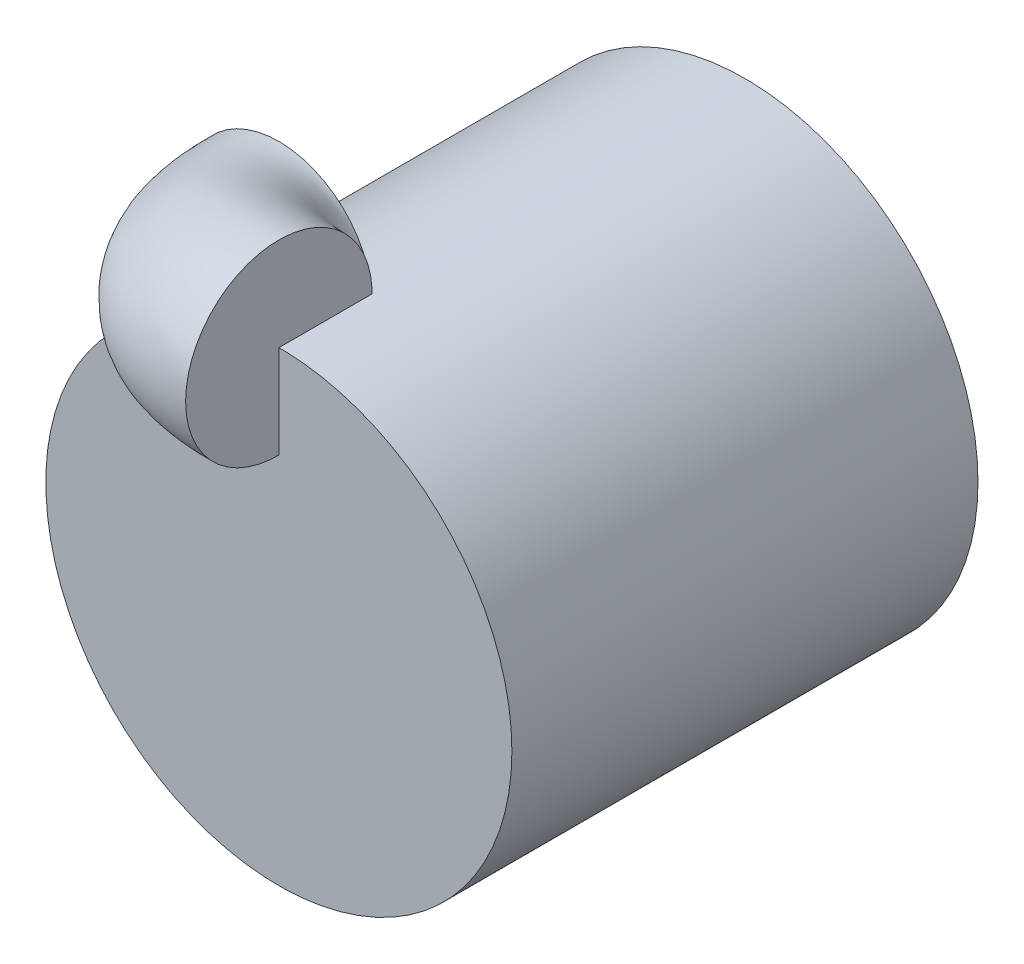
ISO-10303-21;
HEADER;
FILE_DESCRIPTION(('STEP AP214'),'2;1');
FILE_NAME('part.step','',(''),(''),'','','');
FILE_SCHEMA(('AUTOMOTIVE_DESIGN { 1 0 10303 214 1 1 1 1 }'));
ENDSEC;
DATA;
#1=APPLICATION_CONTEXT('core data for automotive mechanical design processes');
#2=APPLICATION_PROTOCOL_DEFINITION('international standard','automotive_design',2000,#1);
#3=PRODUCT_CONTEXT('',#1,'mechanical');
#4=PRODUCT('Part','Part','',(#3));
#5=PRODUCT_RELATED_PRODUCT_CATEGORY('part','',(#4));
#6=PRODUCT_DEFINITION_FORMATION('','',#4);
#7=PRODUCT_DEFINITION_CONTEXT('part definition',#1,'design');
#8=PRODUCT_DEFINITION('design','',#6,#7);
#9=PRODUCT_DEFINITION_SHAPE('','',#8);
#10=(LENGTH_UNIT() NAMED_UNIT(*) SI_UNIT(.MILLI.,.METRE.));
#11=(NAMED_UNIT(*) PLANE_ANGLE_UNIT() SI_UNIT($,.RADIAN.));
#12=(NAMED_UNIT(*) SI_UNIT($,.STERADIAN.) SOLID_ANGLE_UNIT());
#13=UNCERTAINTY_MEASURE_WITH_UNIT(LENGTH_MEASURE(1.E-05),#10,'distance_accuracy_value','');
#14=(GEOMETRIC_REPRESENTATION_CONTEXT(3) GLOBAL_UNCERTAINTY_ASSIGNED_CONTEXT((#13)) GLOBAL_UNIT_ASSIGNED_CONTEXT((#10,
#11,#12)) REPRESENTATION_CONTEXT('',''));
#15=CARTESIAN_POINT('',(0.,0.,0.));
#16=DIRECTION('',(0.,0.,1.));
#17=DIRECTION('',(1.,0.,0.));
#18=AXIS2_PLACEMENT_3D('',#15,#16,#17);
#19=CARTESIAN_POINT('',(-1.25,2.1650635094611,-1.25));
#20=DIRECTION('',(0.,0.,1.));
#21=DIRECTION('',(-0.966372106164342,-0.257147724912146,0.));
#22=AXIS2_PLACEMENT_3D('',#19,#20,#21);
#23=PLANE('',#22);
#24=CARTESIAN_POINT('',(-1.25,2.1650635094611,-1.25));
#25=DIRECTION('',(0.,0.,-1.));
#26=DIRECTION('',(-0.966372106164342,-0.257147724912146,0.));
#27=AXIS2_PLACEMENT_3D('',#24,#25,#26);
#28=CIRCLE('',#27,1.);
#29=CARTESIAN_POINT('',(-2.21637210616434,1.90791578454895,-1.24999999999999));
#30=VERTEX_POINT('',#29);
#31=EDGE_CURVE('E49',#30,#30,#28,.T.);
#32=ORIENTED_EDGE('',*,*,#31,.T.);
#33=EDGE_LOOP('',(#32));
#34=FACE_BOUND('',#33,.T.);
#35=ADVANCED_FACE('F42',(#34),#23,.F.);
#36=CARTESIAN_POINT('',(0.,2.5,0.));
#37=DIRECTION('',(1.,0.,0.));
#38=DIRECTION('',(0.,0.,1.));
#39=AXIS2_PLACEMENT_3D('',#36,#37,#38);
#40=PLANE('',#39);
#41=CARTESIAN_POINT('',(0.,2.5,0.));
#42=DIRECTION('',(-1.,0.,0.));
#43=DIRECTION('',(0.,0.,1.));
#44=AXIS2_PLACEMENT_3D('',#41,#42,#43);
#45=CIRCLE('',#44,1.);
#46=CARTESIAN_POINT('',(0.,2.5,1.));
#47=VERTEX_POINT('',#46);
#48=EDGE_CURVE('E12',#47,#47,#45,.T.);
#49=ORIENTED_EDGE('',*,*,#48,.F.);
#50=EDGE_LOOP('',(#49));
#51=FACE_BOUND('',#50,.T.);
#52=ADVANCED_FACE('F59',(#51),#40,.T.);
#53=CARTESIAN_POINT('',(-2.21637210616434,1.90791578454895,-1.24999999999999));
#54=CARTESIAN_POINT('',(-2.21637204277202,1.9079158294468,-0.999818841970199));
#55=CARTESIAN_POINT('',(-2.17734659589949,1.93081632266178,-0.759523379998778));
#56=CARTESIAN_POINT('',(-2.03135644994759,2.00980930953423,-0.306379773603847));
#57=CARTESIAN_POINT('',(-1.92860055065562,2.06253745159382,-0.104736018125595));
#58=CARTESIAN_POINT('',(-1.66161034219067,2.18187079444576,0.272350489804926));
#59=CARTESIAN_POINT('',(-1.49602176305505,2.24678737741098,0.439674774448092));
#60=CARTESIAN_POINT('',(-1.09699531476877,2.36944390041126,0.729493839687819));
#61=CARTESIAN_POINT('',(-0.865637475439157,2.42345413399622,0.843507948703797));
#62=CARTESIAN_POINT('',(-0.411959624278028,2.48556252003317,0.971375649153301));
#63=CARTESIAN_POINT('',(-0.208302096235686,2.4999999772387,0.999999961640218));
#64=CARTESIAN_POINT('',(0.,2.5,1.));
#65=CARTESIAN_POINT('',(-2.73066755598863,3.84065999687763,-1.25));
#66=CARTESIAN_POINT('',(-2.73066756402875,3.84066000034146,-1.06774443966451));
#67=CARTESIAN_POINT('',(-2.70262921063472,3.8572780924137,-0.880572446657217));
#68=CARTESIAN_POINT('',(-2.5824571176202,3.92230244960168,-0.507548456152736));
#69=CARTESIAN_POINT('',(-2.49087897513859,3.97002252607221,-0.317758308875062));
#70=CARTESIAN_POINT('',(-2.21702274044598,4.09242640527374,0.0690402446537711));
#71=CARTESIAN_POINT('',(-2.03393967495304,4.16582603972012,0.261904741466474));
#72=CARTESIAN_POINT('',(-1.53650912760025,4.31873254369699,0.623206029513072));
#73=CARTESIAN_POINT('',(-1.23360012472932,4.3913898135576,0.777888113925743));
#74=CARTESIAN_POINT('',(-0.592235452757225,4.47919343887022,0.958659088703732));
#75=CARTESIAN_POINT('',(-0.303472023666575,4.49999995276833,0.999999912730327));
#76=CARTESIAN_POINT('',(0.,4.5,1.));
#77=CARTESIAN_POINT('',(-0.79792334365995,4.35495544670193,-1.25));
#78=CARTESIAN_POINT('',(-0.797923455424761,4.35495539187898,-1.30845565020694));
#79=CARTESIAN_POINT('',(-0.806136391135083,4.35055682361534,-1.33900777997171));
#80=CARTESIAN_POINT('',(-0.821104047219045,4.34246329664357,-1.38544884787896));
#81=CARTESIAN_POINT('',(-0.818754853631671,4.34501128619799,-1.36805798059084));
#82=CARTESIAN_POINT('',(-0.777318302527435,4.36353901752362,-1.30951874503577));
#83=CARTESIAN_POINT('',(-0.730685378542684,4.38402235089432,-1.25420288581428));
#84=CARTESIAN_POINT('',(-0.576719206065461,4.43135695083886,-1.14236368679376));
#85=CARTESIAN_POINT('',(-0.466455348859336,4.45912745536748,-1.08346509619701));
#86=CARTESIAN_POINT('',(-0.228890194289284,4.49165325942428,-1.01650383748423));
#87=CARTESIAN_POINT('',(-0.115603167640984,4.49999998259986,-1.00000002719376));
#88=CARTESIAN_POINT('',(0.,4.5,-1.));
#89=CARTESIAN_POINT('',(-0.283627893835658,2.42221123437324,-1.25));
#90=CARTESIAN_POINT('',(-0.283627934168083,2.42221122098448,-1.24053005251257));
#91=CARTESIAN_POINT('',(-0.280853776399838,2.42409505386344,-1.21795871331326));
#92=CARTESIAN_POINT('',(-0.270003379546456,2.4299701565761,-1.18428016533008));
#93=CARTESIAN_POINT('',(-0.256476429148701,2.4375262117196,-1.15503568984138));
#94=CARTESIAN_POINT('',(-0.221905904272125,2.45298340669565,-1.10620849988461));
#95=CARTESIAN_POINT('',(-0.192767466644681,2.46498368858515,-1.07643285283267));
#96=CARTESIAN_POINT('',(-0.137205393233996,2.48206830755316,-1.03607587661901));
#97=CARTESIAN_POINT('',(-0.0984926995691702,2.49119177580607,-1.01784526141895));
#98=CARTESIAN_POINT('',(-0.0486143658100851,2.49802234058725,-1.00378727703466));
#99=CARTESIAN_POINT('',(-0.020433240210095,2.50000000707025,-0.999999978283874));
#100=CARTESIAN_POINT('',(0.,2.5,-1.));
#101=CARTESIAN_POINT('',(0.230667555988633,0.489467022044559,-1.24999999999999));
#102=CARTESIAN_POINT('',(0.230667587088596,0.489467050089991,-1.17260445481821));
#103=CARTESIAN_POINT('',(0.244428838335407,0.497633284111534,-1.09690964665481));
#104=CARTESIAN_POINT('',(0.281097288126133,0.517477016508641,-0.983111482781196));
#105=CARTESIAN_POINT('',(0.305801995334269,0.530041137241208,-0.942013399091919));
#106=CARTESIAN_POINT('',(0.333506493983185,0.542427795867671,-0.90289825473345));
#107=CARTESIAN_POINT('',(0.345150445253322,0.545945026275985,-0.898662819851062));
#108=CARTESIAN_POINT('',(0.302308419597469,0.532779664267467,-0.929788066444254));
#109=CARTESIAN_POINT('',(0.269469949720995,0.523256096244662,-0.952225426640894));
#110=CARTESIAN_POINT('',(0.131661462669113,0.504391421750217,-0.991070716585095));
#111=CARTESIAN_POINT('',(0.074736687220794,0.500000031540635,-0.999999929373984));
#112=CARTESIAN_POINT('',(0.,0.5,-1.));
#113=CARTESIAN_POINT('',(-1.70207665634005,-0.0248284277797322,-1.24999999999999));
#114=CARTESIAN_POINT('',(-1.70207652151529,-0.0248283414478514,-0.931893244275884));
#115=CARTESIAN_POINT('',(-1.65206398116427,0.00435455290987249,-0.63847431334034));
#116=CARTESIAN_POINT('',(-1.48025578227499,0.0973161694667689,-0.105211091054959));
#117=CARTESIAN_POINT('',(-1.36632212617265,0.155052377115426,0.108286272623872));
#118=CARTESIAN_POINT('',(-1.10619794393536,0.271315183617787,0.475660734956081));
#119=CARTESIAN_POINT('',(-0.958103851157058,0.327748715101847,0.617444807429709));
#120=CARTESIAN_POINT('',(-0.657481501937292,0.42015525712553,0.835781649862566));
#121=CARTESIAN_POINT('',(-0.497674826148989,0.455518454434832,0.909127783481852));
#122=CARTESIAN_POINT('',(-0.231683795798831,0.491931601196125,0.984092209602869));
#123=CARTESIAN_POINT('',(-0.113132168804797,0.500000001709063,1.00000001055011));
#124=CARTESIAN_POINT('',(0.,0.5,1.));
#125=CARTESIAN_POINT('',(-2.21637210616434,1.90791578454895,-1.24999999999999));
#126=CARTESIAN_POINT('',(-2.21637204277202,1.9079158294468,-0.999818841970199));
#127=CARTESIAN_POINT('',(-2.17734659589949,1.93081632266178,-0.759523379998778));
#128=CARTESIAN_POINT('',(-2.03135644994759,2.00980930953423,-0.306379773603847));
#129=CARTESIAN_POINT('',(-1.92860055065562,2.06253745159382,-0.104736018125595));
#130=CARTESIAN_POINT('',(-1.66161034219067,2.18187079444576,0.272350489804926));
#131=CARTESIAN_POINT('',(-1.49602176305505,2.24678737741098,0.439674774448092));
#132=CARTESIAN_POINT('',(-1.09699531476877,2.36944390041126,0.729493839687819));
#133=CARTESIAN_POINT('',(-0.865637475439157,2.42345413399622,0.843507948703797));
#134=CARTESIAN_POINT('',(-0.411959624278028,2.48556252003317,0.971375649153301));
#135=CARTESIAN_POINT('',(-0.208302096235686,2.4999999772387,0.999999961640218));
#136=CARTESIAN_POINT('',(0.,2.5,1.));
#137=(BOUNDED_SURFACE() B_SPLINE_SURFACE(3,3,((#53,#54,#55,#56,#57,#58,#59,#60,#61,#62,#63,#64),
(#65,#66,#67,#68,#69,#70,#71,#72,#73,#74,#75,#76),(#77,#78,#79,#80,#81,#82,#83,#84,#85,#86,#87,
#88),(#89,#90,#91,#92,#93,#94,#95,#96,#97,#98,#99,#100),(#101,#102,#103,#104,#105,#106,#107,
#108,#109,#110,#111,#112),(#113,#114,#115,#116,#117,#118,#119,#120,#121,#122,#123,#124),(#125,
#126,#127,#128,#129,#130,#131,#132,#133,#134,#135,#136)),.UNSPECIFIED.,.T.,.F.,
.F.) B_SPLINE_SURFACE_WITH_KNOTS((4,3,4),(4,2,2,2,2,4),(0.,0.5,1.),(0.,0.196014952307082,
0.390899893872645,0.602085087624067,0.828030417495066,1.),
.UNSPECIFIED.) GEOMETRIC_REPRESENTATION_ITEM() RATIONAL_B_SPLINE_SURFACE(((1.,1.,1.,1.,1.,1.,1.,
1.,1.,1.,1.,1.),(0.333333333333333,0.333333333333333,0.333333333333333,0.333333333333333,
0.333333333333333,0.333333333333333,0.333333333333333,0.333333333333333,0.333333333333333,
0.333333333333333,0.333333333333333,0.333333333333333),(0.333333333333333,0.333333333333333,
0.333333333333333,0.333333333333333,0.333333333333333,0.333333333333333,0.333333333333333,
0.333333333333333,0.333333333333333,0.333333333333333,0.333333333333333,0.333333333333333),(1.,
1.,1.,1.,1.,1.,1.,1.,1.,1.,1.,1.),(0.333333333333333,0.333333333333333,0.333333333333333,
0.333333333333333,0.333333333333333,0.333333333333333,0.333333333333333,0.333333333333333,
0.333333333333333,0.333333333333333,0.333333333333333,0.333333333333333),(0.333333333333333,
0.333333333333333,0.333333333333333,0.333333333333333,0.333333333333333,0.333333333333333,
0.333333333333333,0.333333333333333,0.333333333333333,0.333333333333333,0.333333333333333,
0.333333333333333),(1.,1.,1.,1.,1.,1.,1.,1.,1.,1.,1.,1.))) REPRESENTATION_ITEM('') SURFACE());
#138=ORIENTED_EDGE('',*,*,#48,.T.);
#139=EDGE_LOOP('',(#138));
#140=FACE_BOUND('',#139,.T.);
#141=ORIENTED_EDGE('',*,*,#31,.F.);
#142=EDGE_LOOP('',(#141));
#143=FACE_BOUND('',#142,.T.);
#144=ADVANCED_FACE('F56',(#140,#143),#137,.F.);
#145=CLOSED_SHELL('',(#35,#52,#144));
#146=MANIFOLD_SOLID_BREP('B2',#145);
#147=CARTESIAN_POINT('',(0.,0.,-5.));
#148=DIRECTION('',(0.,0.,1.));
#149=DIRECTION('',(-1.,0.,0.));
#150=AXIS2_PLACEMENT_3D('',#147,#148,#149);
#151=CYLINDRICAL_SURFACE('',#150,2.5);
#152=CARTESIAN_POINT('',(0.,0.,-5.));
#153=DIRECTION('',(0.,0.,1.));
#154=DIRECTION('',(1.,0.,0.));
#155=AXIS2_PLACEMENT_3D('',#152,#153,#154);
#156=CIRCLE('',#155,2.5);
#157=CARTESIAN_POINT('',(2.5,0.,-5.));
#158=VERTEX_POINT('',#157);
#159=EDGE_CURVE('E41',#158,#158,#156,.T.);
#160=ORIENTED_EDGE('',*,*,#159,.T.);
#161=EDGE_LOOP('',(#160));
#162=FACE_BOUND('',#161,.T.);
#163=CARTESIAN_POINT('',(0.,0.,0.));
#164=DIRECTION('',(0.,0.,1.));
#165=DIRECTION('',(1.,0.,0.));
#166=AXIS2_PLACEMENT_3D('',#163,#164,#165);
#167=CIRCLE('',#166,2.5);
#168=CARTESIAN_POINT('',(2.5,0.,0.));
#169=VERTEX_POINT('',#168);
#170=EDGE_CURVE('E94',#169,#169,#167,.T.);
#171=ORIENTED_EDGE('',*,*,#170,.F.);
#172=EDGE_LOOP('',(#171));
#173=FACE_BOUND('',#172,.T.);
#174=ADVANCED_FACE('F91',(#162,#173),#151,.T.);
#175=CARTESIAN_POINT('',(0.,0.,-5.));
#176=DIRECTION('',(0.,0.,-1.));
#177=DIRECTION('',(1.,0.,0.));
#178=AXIS2_PLACEMENT_3D('',#175,#176,#177);
#179=PLANE('',#178);
#180=ORIENTED_EDGE('',*,*,#159,.F.);
#181=EDGE_LOOP('',(#180));
#182=FACE_BOUND('',#181,.T.);
#183=ADVANCED_FACE('F106',(#182),#179,.T.);
#184=CARTESIAN_POINT('',(0.,0.,0.));
#185=DIRECTION('',(0.,0.,-1.));
#186=DIRECTION('',(1.,0.,0.));
#187=AXIS2_PLACEMENT_3D('',#184,#185,#186);
#188=PLANE('',#187);
#189=ORIENTED_EDGE('',*,*,#170,.T.);
#190=EDGE_LOOP('',(#189));
#191=FACE_BOUND('',#190,.T.);
#192=ADVANCED_FACE('F103',(#191),#188,.F.);
#193=CLOSED_SHELL('',(#174,#183,#192));
#194=MANIFOLD_SOLID_BREP('B6_NOT_SHOWN',#193);
#195=ADVANCED_BREP_SHAPE_REPRESENTATION('',(#18,#146,#194),#14);
#196=SHAPE_DEFINITION_REPRESENTATION(#9,#195);
ENDSEC;
END-ISO-10303-21;
